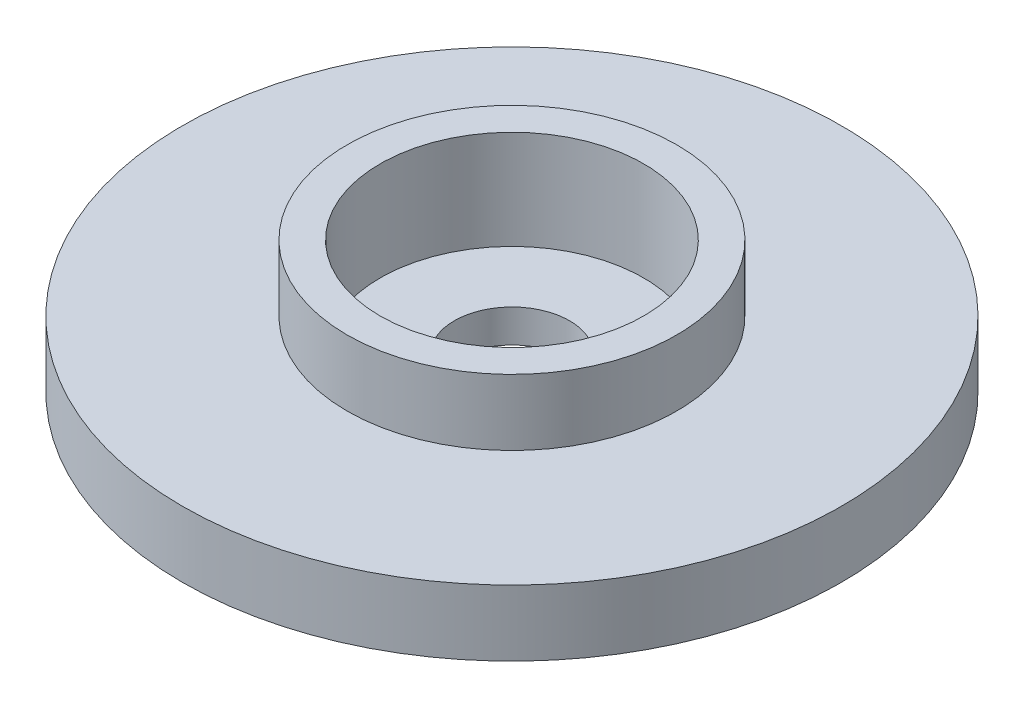
ISO-10303-21;
HEADER;
FILE_DESCRIPTION(('STEP AP214'),'2;1');
FILE_NAME('part.step','',(''),(''),'','','');
FILE_SCHEMA(('AUTOMOTIVE_DESIGN { 1 0 10303 214 1 1 1 1 }'));
ENDSEC;
DATA;
#1=APPLICATION_CONTEXT('core data for automotive mechanical design processes');
#2=APPLICATION_PROTOCOL_DEFINITION('international standard','automotive_design',2000,#1);
#3=PRODUCT_CONTEXT('',#1,'mechanical');
#4=PRODUCT('Part','Part','',(#3));
#5=PRODUCT_RELATED_PRODUCT_CATEGORY('part','',(#4));
#6=PRODUCT_DEFINITION_FORMATION('','',#4);
#7=PRODUCT_DEFINITION_CONTEXT('part definition',#1,'design');
#8=PRODUCT_DEFINITION('design','',#6,#7);
#9=PRODUCT_DEFINITION_SHAPE('','',#8);
#10=(LENGTH_UNIT() NAMED_UNIT(*) SI_UNIT(.MILLI.,.METRE.));
#11=(NAMED_UNIT(*) PLANE_ANGLE_UNIT() SI_UNIT($,.RADIAN.));
#12=(NAMED_UNIT(*) SI_UNIT($,.STERADIAN.) SOLID_ANGLE_UNIT());
#13=UNCERTAINTY_MEASURE_WITH_UNIT(LENGTH_MEASURE(1.E-05),#10,'distance_accuracy_value','');
#14=(GEOMETRIC_REPRESENTATION_CONTEXT(3) GLOBAL_UNCERTAINTY_ASSIGNED_CONTEXT((#13)) GLOBAL_UNIT_ASSIGNED_CONTEXT((#10,
#11,#12)) REPRESENTATION_CONTEXT('',''));
#15=CARTESIAN_POINT('',(0.,0.,0.));
#16=DIRECTION('',(0.,0.,1.));
#17=DIRECTION('',(1.,0.,0.));
#18=AXIS2_PLACEMENT_3D('',#15,#16,#17);
#19=CARTESIAN_POINT('',(0.,0.,0.));
#20=DIRECTION('',(0.,1.,0.));
#21=DIRECTION('',(0.,0.,1.));
#22=AXIS2_PLACEMENT_3D('',#19,#20,#21);
#23=CYLINDRICAL_SURFACE('',#22,1.75);
#24=CARTESIAN_POINT('',(0.,0.,0.));
#25=DIRECTION('',(0.,1.,0.));
#26=DIRECTION('',(0.,0.,1.));
#27=AXIS2_PLACEMENT_3D('',#24,#25,#26);
#28=CIRCLE('',#27,1.75);
#29=CARTESIAN_POINT('',(0.,0.,1.75));
#30=VERTEX_POINT('',#29);
#31=EDGE_CURVE('E51',#30,#30,#28,.T.);
#32=ORIENTED_EDGE('',*,*,#31,.F.);
#33=EDGE_LOOP('',(#32));
#34=FACE_BOUND('',#33,.T.);
#35=CARTESIAN_POINT('',(0.,1.,0.));
#36=DIRECTION('',(0.,1.,0.));
#37=DIRECTION('',(0.,0.,1.));
#38=AXIS2_PLACEMENT_3D('',#35,#36,#37);
#39=CIRCLE('',#38,1.75);
#40=CARTESIAN_POINT('',(0.,1.,1.75));
#41=VERTEX_POINT('',#40);
#42=EDGE_CURVE('E37',#41,#41,#39,.F.);
#43=ORIENTED_EDGE('',*,*,#42,.F.);
#44=EDGE_LOOP('',(#43));
#45=FACE_BOUND('',#44,.T.);
#46=ADVANCED_FACE('F33',(#34,#45),#23,.F.);
#47=CARTESIAN_POINT('',(0.,2.,0.));
#48=DIRECTION('',(0.,-1.,0.));
#49=DIRECTION('',(0.,0.,-1.));
#50=AXIS2_PLACEMENT_3D('',#47,#48,#49);
#51=CYLINDRICAL_SURFACE('',#50,10.);
#52=CARTESIAN_POINT('',(0.,2.,0.));
#53=DIRECTION('',(0.,1.,0.));
#54=DIRECTION('',(0.,0.,1.));
#55=AXIS2_PLACEMENT_3D('',#52,#53,#54);
#56=CIRCLE('',#55,10.);
#57=CARTESIAN_POINT('',(0.,2.,10.));
#58=VERTEX_POINT('',#57);
#59=EDGE_CURVE('E10',#58,#58,#56,.T.);
#60=ORIENTED_EDGE('',*,*,#59,.F.);
#61=EDGE_LOOP('',(#60));
#62=FACE_BOUND('',#61,.T.);
#63=CARTESIAN_POINT('',(0.,0.,0.));
#64=DIRECTION('',(0.,1.,0.));
#65=DIRECTION('',(0.,0.,1.));
#66=AXIS2_PLACEMENT_3D('',#63,#64,#65);
#67=CIRCLE('',#66,10.);
#68=CARTESIAN_POINT('',(0.,0.,10.));
#69=VERTEX_POINT('',#68);
#70=EDGE_CURVE('E41',#69,#69,#67,.T.);
#71=ORIENTED_EDGE('',*,*,#70,.T.);
#72=EDGE_LOOP('',(#71));
#73=FACE_BOUND('',#72,.T.);
#74=ADVANCED_FACE('F35',(#62,#73),#51,.T.);
#75=CARTESIAN_POINT('',(0.,2.,0.));
#76=DIRECTION('',(0.,1.,0.));
#77=DIRECTION('',(0.,0.,1.));
#78=AXIS2_PLACEMENT_3D('',#75,#76,#77);
#79=PLANE('',#78);
#80=CARTESIAN_POINT('',(0.,2.,0.));
#81=DIRECTION('',(0.,1.,0.));
#82=DIRECTION('',(0.,0.,1.));
#83=AXIS2_PLACEMENT_3D('',#80,#81,#82);
#84=CIRCLE('',#83,5.);
#85=CARTESIAN_POINT('',(0.,2.,5.));
#86=VERTEX_POINT('',#85);
#87=EDGE_CURVE('E48',#86,#86,#84,.T.);
#88=ORIENTED_EDGE('',*,*,#87,.F.);
#89=EDGE_LOOP('',(#88));
#90=FACE_BOUND('',#89,.T.);
#91=ORIENTED_EDGE('',*,*,#59,.T.);
#92=EDGE_LOOP('',(#91));
#93=FACE_BOUND('',#92,.T.);
#94=ADVANCED_FACE('F74',(#90,#93),#79,.T.);
#95=CARTESIAN_POINT('',(0.,0.,0.));
#96=DIRECTION('',(0.,1.,0.));
#97=DIRECTION('',(0.,0.,1.));
#98=AXIS2_PLACEMENT_3D('',#95,#96,#97);
#99=PLANE('',#98);
#100=ORIENTED_EDGE('',*,*,#31,.T.);
#101=EDGE_LOOP('',(#100));
#102=FACE_BOUND('',#101,.T.);
#103=ORIENTED_EDGE('',*,*,#70,.F.);
#104=EDGE_LOOP('',(#103));
#105=FACE_BOUND('',#104,.T.);
#106=ADVANCED_FACE('F88',(#102,#105),#99,.F.);
#107=CARTESIAN_POINT('',(0.,4.,0.));
#108=DIRECTION('',(0.,-1.,0.));
#109=DIRECTION('',(0.,0.,-1.));
#110=AXIS2_PLACEMENT_3D('',#107,#108,#109);
#111=CYLINDRICAL_SURFACE('',#110,5.);
#112=CARTESIAN_POINT('',(0.,4.,0.));
#113=DIRECTION('',(0.,1.,0.));
#114=DIRECTION('',(0.,0.,1.));
#115=AXIS2_PLACEMENT_3D('',#112,#113,#114);
#116=CIRCLE('',#115,5.);
#117=CARTESIAN_POINT('',(0.,4.,5.));
#118=VERTEX_POINT('',#117);
#119=EDGE_CURVE('E46',#118,#118,#116,.T.);
#120=ORIENTED_EDGE('',*,*,#119,.F.);
#121=EDGE_LOOP('',(#120));
#122=FACE_BOUND('',#121,.T.);
#123=ORIENTED_EDGE('',*,*,#87,.T.);
#124=EDGE_LOOP('',(#123));
#125=FACE_BOUND('',#124,.T.);
#126=ADVANCED_FACE('F84',(#122,#125),#111,.T.);
#127=CARTESIAN_POINT('',(0.,4.,0.));
#128=DIRECTION('',(0.,1.,0.));
#129=DIRECTION('',(0.,0.,1.));
#130=AXIS2_PLACEMENT_3D('',#127,#128,#129);
#131=PLANE('',#130);
#132=CARTESIAN_POINT('',(0.,4.,0.));
#133=DIRECTION('',(0.,1.,0.));
#134=DIRECTION('',(0.,0.,1.));
#135=AXIS2_PLACEMENT_3D('',#132,#133,#134);
#136=CIRCLE('',#135,4.);
#137=CARTESIAN_POINT('',(0.,4.,4.));
#138=VERTEX_POINT('',#137);
#139=EDGE_CURVE('E56',#138,#138,#136,.T.);
#140=ORIENTED_EDGE('',*,*,#139,.F.);
#141=EDGE_LOOP('',(#140));
#142=FACE_BOUND('',#141,.T.);
#143=ORIENTED_EDGE('',*,*,#119,.T.);
#144=EDGE_LOOP('',(#143));
#145=FACE_BOUND('',#144,.T.);
#146=ADVANCED_FACE('F81',(#142,#145),#131,.T.);
#147=CARTESIAN_POINT('',(0.,1.,0.));
#148=DIRECTION('',(0.,1.,0.));
#149=DIRECTION('',(0.,0.,1.));
#150=AXIS2_PLACEMENT_3D('',#147,#148,#149);
#151=PLANE('',#150);
#152=CARTESIAN_POINT('',(0.,1.,0.));
#153=DIRECTION('',(0.,1.,0.));
#154=DIRECTION('',(0.,0.,1.));
#155=AXIS2_PLACEMENT_3D('',#152,#153,#154);
#156=CIRCLE('',#155,4.);
#157=CARTESIAN_POINT('',(0.,1.,4.));
#158=VERTEX_POINT('',#157);
#159=EDGE_CURVE('E59',#158,#158,#156,.T.);
#160=ORIENTED_EDGE('',*,*,#159,.T.);
#161=EDGE_LOOP('',(#160));
#162=FACE_BOUND('',#161,.T.);
#163=ORIENTED_EDGE('',*,*,#42,.T.);
#164=EDGE_LOOP('',(#163));
#165=FACE_BOUND('',#164,.T.);
#166=ADVANCED_FACE('F66',(#162,#165),#151,.T.);
#167=CARTESIAN_POINT('',(0.,1.,0.));
#168=DIRECTION('',(0.,1.,0.));
#169=DIRECTION('',(0.,0.,1.));
#170=AXIS2_PLACEMENT_3D('',#167,#168,#169);
#171=CYLINDRICAL_SURFACE('',#170,4.);
#172=ORIENTED_EDGE('',*,*,#159,.F.);
#173=EDGE_LOOP('',(#172));
#174=FACE_BOUND('',#173,.T.);
#175=ORIENTED_EDGE('',*,*,#139,.T.);
#176=EDGE_LOOP('',(#175));
#177=FACE_BOUND('',#176,.T.);
#178=ADVANCED_FACE('F79',(#174,#177),#171,.F.);
#179=CLOSED_SHELL('',(#46,#74,#94,#106,#126,#146,#166,#178));
#180=MANIFOLD_SOLID_BREP('B2',#179);
#181=ADVANCED_BREP_SHAPE_REPRESENTATION('',(#18,#180),#14);
#182=SHAPE_DEFINITION_REPRESENTATION(#9,#181);
ENDSEC;
END-ISO-10303-21;
